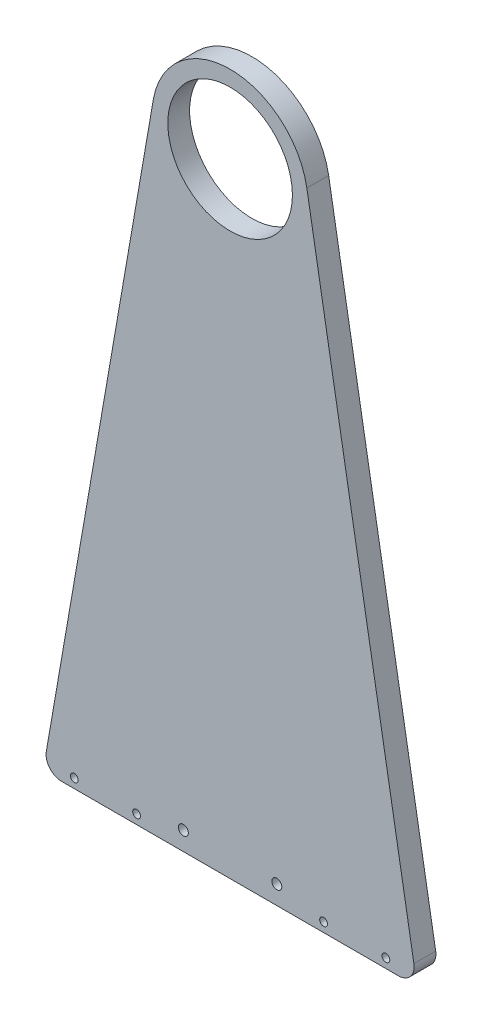
ISO-10303-21;
HEADER;
FILE_DESCRIPTION(('STEP AP214'),'2;1');
FILE_NAME('part.step','',(''),(''),'','','');
FILE_SCHEMA(('AUTOMOTIVE_DESIGN { 1 0 10303 214 1 1 1 1 }'));
ENDSEC;
DATA;
#1=APPLICATION_CONTEXT('core data for automotive mechanical design processes');
#2=APPLICATION_PROTOCOL_DEFINITION('international standard','automotive_design',2000,#1);
#3=PRODUCT_CONTEXT('',#1,'mechanical');
#4=PRODUCT('Part','Part','',(#3));
#5=PRODUCT_RELATED_PRODUCT_CATEGORY('part','',(#4));
#6=PRODUCT_DEFINITION_FORMATION('','',#4);
#7=PRODUCT_DEFINITION_CONTEXT('part definition',#1,'design');
#8=PRODUCT_DEFINITION('design','',#6,#7);
#9=PRODUCT_DEFINITION_SHAPE('','',#8);
#10=(LENGTH_UNIT() NAMED_UNIT(*) SI_UNIT(.MILLI.,.METRE.));
#11=(NAMED_UNIT(*) PLANE_ANGLE_UNIT() SI_UNIT($,.RADIAN.));
#12=(NAMED_UNIT(*) SI_UNIT($,.STERADIAN.) SOLID_ANGLE_UNIT());
#13=UNCERTAINTY_MEASURE_WITH_UNIT(LENGTH_MEASURE(1.E-05),#10,'distance_accuracy_value','');
#14=(GEOMETRIC_REPRESENTATION_CONTEXT(3) GLOBAL_UNCERTAINTY_ASSIGNED_CONTEXT((#13)) GLOBAL_UNIT_ASSIGNED_CONTEXT((#10,
#11,#12)) REPRESENTATION_CONTEXT('',''));
#15=CARTESIAN_POINT('',(0.,0.,0.));
#16=DIRECTION('',(0.,0.,1.));
#17=DIRECTION('',(1.,0.,0.));
#18=AXIS2_PLACEMENT_3D('',#15,#16,#17);
#19=CARTESIAN_POINT('',(0.,0.,7.));
#20=DIRECTION('',(0.,0.,-1.));
#21=DIRECTION('',(-1.,0.,0.));
#22=AXIS2_PLACEMENT_3D('',#19,#20,#21);
#23=CYLINDRICAL_SURFACE('',#22,25.);
#24=CARTESIAN_POINT('',(0.,0.,0.));
#25=DIRECTION('',(0.,0.,1.));
#26=DIRECTION('',(1.,0.,0.));
#27=AXIS2_PLACEMENT_3D('',#24,#25,#26);
#28=CIRCLE('',#27,25.);
#29=CARTESIAN_POINT('',(-24.633500506454,4.26505015193619,0.));
#30=VERTEX_POINT('',#29);
#31=CARTESIAN_POINT('',(24.633500506454,4.26505015193636,0.));
#32=VERTEX_POINT('',#31);
#33=EDGE_CURVE('E102',#30,#32,#28,.F.);
#34=ORIENTED_EDGE('',*,*,#33,.F.);
#35=DIRECTION('',(0.,0.,-1.));
#36=VECTOR('',#35,1.);
#37=CARTESIAN_POINT('',(-24.633500506454,4.26505015193619,7.));
#38=LINE('',#37,#36);
#39=CARTESIAN_POINT('',(-24.633500506454,4.26505015193619,7.));
#40=VERTEX_POINT('',#39);
#41=EDGE_CURVE('E97',#40,#30,#38,.T.);
#42=ORIENTED_EDGE('',*,*,#41,.F.);
#43=CARTESIAN_POINT('',(0.,0.,7.));
#44=DIRECTION('',(0.,0.,1.));
#45=DIRECTION('',(1.,0.,0.));
#46=AXIS2_PLACEMENT_3D('',#43,#44,#45);
#47=CIRCLE('',#46,25.);
#48=CARTESIAN_POINT('',(24.633500506454,4.26505015193636,7.));
#49=VERTEX_POINT('',#48);
#50=EDGE_CURVE('E99',#40,#49,#47,.F.);
#51=ORIENTED_EDGE('',*,*,#50,.T.);
#52=DIRECTION('',(0.,0.,-1.));
#53=VECTOR('',#52,1.);
#54=CARTESIAN_POINT('',(24.633500506454,4.26505015193636,7.));
#55=LINE('',#54,#53);
#56=EDGE_CURVE('E105',#49,#32,#55,.T.);
#57=ORIENTED_EDGE('',*,*,#56,.T.);
#58=EDGE_LOOP('',(#34,#42,#51,#57));
#59=FACE_BOUND('',#58,.T.);
#60=ADVANCED_FACE('F40',(#59),#23,.T.);
#61=CARTESIAN_POINT('',(-24.633500506454,4.26505015193612,7.));
#62=DIRECTION('',(0.98534002025816,-0.170602006077445,0.));
#63=DIRECTION('',(0.170602006077445,0.98534002025816,0.));
#64=AXIS2_PLACEMENT_3D('',#61,#62,#63);
#65=PLANE('',#64);
#66=DIRECTION('',(-0.170602006077445,-0.98534002025816,0.));
#67=VECTOR('',#66,1.);
#68=CARTESIAN_POINT('',(-24.633500506454,4.26505015193612,0.));
#69=LINE('',#68,#67);
#70=CARTESIAN_POINT('',(-58.9866084475951,-194.146989969613,0.));
#71=VERTEX_POINT('',#70);
#72=EDGE_CURVE('E128',#30,#71,#69,.T.);
#73=ORIENTED_EDGE('',*,*,#72,.T.);
#74=DIRECTION('',(0.,0.,-1.));
#75=VECTOR('',#74,1.);
#76=CARTESIAN_POINT('',(-58.9866084475951,-194.146989969613,7.));
#77=LINE('',#76,#75);
#78=CARTESIAN_POINT('',(-58.9866084475951,-194.146989969613,7.));
#79=VERTEX_POINT('',#78);
#80=EDGE_CURVE('E11',#71,#79,#77,.F.);
#81=ORIENTED_EDGE('',*,*,#80,.T.);
#82=DIRECTION('',(-0.170602006077445,-0.98534002025816,0.));
#83=VECTOR('',#82,1.);
#84=CARTESIAN_POINT('',(-24.633500506454,4.26505015193612,7.));
#85=LINE('',#84,#83);
#86=EDGE_CURVE('E107',#40,#79,#85,.T.);
#87=ORIENTED_EDGE('',*,*,#86,.F.);
#88=ORIENTED_EDGE('',*,*,#41,.T.);
#89=EDGE_LOOP('',(#73,#81,#87,#88));
#90=FACE_BOUND('',#89,.T.);
#91=ADVANCED_FACE('F108',(#90),#65,.F.);
#92=CARTESIAN_POINT('',(0.,-200.,7.));
#93=DIRECTION('',(0.,1.,0.));
#94=DIRECTION('',(0.,0.,1.));
#95=AXIS2_PLACEMENT_3D('',#92,#93,#94);
#96=PLANE('',#95);
#97=DIRECTION('',(1.,0.,0.));
#98=VECTOR('',#97,1.);
#99=CARTESIAN_POINT('',(0.,-200.,0.));
#100=LINE('',#99,#98);
#101=CARTESIAN_POINT('',(-54.0599083463042,-200.,0.));
#102=VERTEX_POINT('',#101);
#103=CARTESIAN_POINT('',(54.0599083463056,-200.,0.));
#104=VERTEX_POINT('',#103);
#105=EDGE_CURVE('E119',#102,#104,#100,.T.);
#106=ORIENTED_EDGE('',*,*,#105,.T.);
#107=DIRECTION('',(0.,0.,-1.));
#108=VECTOR('',#107,1.);
#109=CARTESIAN_POINT('',(54.0599083463056,-200.,7.));
#110=LINE('',#109,#108);
#111=CARTESIAN_POINT('',(54.0599083463056,-200.,7.));
#112=VERTEX_POINT('',#111);
#113=EDGE_CURVE('E63',#104,#112,#110,.F.);
#114=ORIENTED_EDGE('',*,*,#113,.T.);
#115=DIRECTION('',(1.,0.,0.));
#116=VECTOR('',#115,1.);
#117=CARTESIAN_POINT('',(0.,-200.,7.));
#118=LINE('',#117,#116);
#119=CARTESIAN_POINT('',(-54.0599083463042,-200.,7.));
#120=VERTEX_POINT('',#119);
#121=EDGE_CURVE('E111',#120,#112,#118,.T.);
#122=ORIENTED_EDGE('',*,*,#121,.F.);
#123=DIRECTION('',(0.,0.,-1.));
#124=VECTOR('',#123,1.);
#125=CARTESIAN_POINT('',(-54.0599083463042,-200.,7.));
#126=LINE('',#125,#124);
#127=EDGE_CURVE('E139',#120,#102,#126,.T.);
#128=ORIENTED_EDGE('',*,*,#127,.T.);
#129=EDGE_LOOP('',(#106,#114,#122,#128));
#130=FACE_BOUND('',#129,.T.);
#131=ADVANCED_FACE('F232',(#130),#96,.F.);
#132=CARTESIAN_POINT('',(24.633500506454,4.26505015193628,7.));
#133=DIRECTION('',(0.985340020258159,0.170602006077451,0.));
#134=DIRECTION('',(-0.170602006077451,0.985340020258159,0.));
#135=AXIS2_PLACEMENT_3D('',#132,#133,#134);
#136=PLANE('',#135);
#137=DIRECTION('',(0.170602006077451,-0.985340020258159,0.));
#138=VECTOR('',#137,1.);
#139=CARTESIAN_POINT('',(24.633500506454,4.26505015193628,7.));
#140=LINE('',#139,#138);
#141=CARTESIAN_POINT('',(58.9866084475964,-194.146989969613,7.));
#142=VERTEX_POINT('',#141);
#143=EDGE_CURVE('E115',#49,#142,#140,.T.);
#144=ORIENTED_EDGE('',*,*,#143,.T.);
#145=DIRECTION('',(0.,0.,-1.));
#146=VECTOR('',#145,1.);
#147=CARTESIAN_POINT('',(58.9866084475964,-194.146989969613,0.));
#148=LINE('',#147,#146);
#149=CARTESIAN_POINT('',(58.9866084475964,-194.146989969613,0.));
#150=VERTEX_POINT('',#149);
#151=EDGE_CURVE('E104',#142,#150,#148,.T.);
#152=ORIENTED_EDGE('',*,*,#151,.T.);
#153=DIRECTION('',(0.170602006077451,-0.985340020258159,0.));
#154=VECTOR('',#153,1.);
#155=CARTESIAN_POINT('',(24.633500506454,4.26505015193628,0.));
#156=LINE('',#155,#154);
#157=EDGE_CURVE('E116',#32,#150,#156,.T.);
#158=ORIENTED_EDGE('',*,*,#157,.F.);
#159=ORIENTED_EDGE('',*,*,#56,.F.);
#160=EDGE_LOOP('',(#144,#152,#158,#159));
#161=FACE_BOUND('',#160,.T.);
#162=ADVANCED_FACE('F200',(#161),#136,.T.);
#163=CARTESIAN_POINT('',(0.,0.,7.));
#164=DIRECTION('',(0.,0.,1.));
#165=DIRECTION('',(1.,0.,0.));
#166=AXIS2_PLACEMENT_3D('',#163,#164,#165);
#167=PLANE('',#166);
#168=CARTESIAN_POINT('',(-50.0017140023922,-197.,7.));
#169=DIRECTION('',(0.,0.,1.));
#170=DIRECTION('',(1.,0.,0.));
#171=AXIS2_PLACEMENT_3D('',#168,#169,#170);
#172=CIRCLE('',#171,1.25);
#173=CARTESIAN_POINT('',(-48.7517140023922,-197.,7.));
#174=VERTEX_POINT('',#173);
#175=EDGE_CURVE('E150',#174,#174,#172,.T.);
#176=ORIENTED_EDGE('',*,*,#175,.F.);
#177=EDGE_LOOP('',(#176));
#178=FACE_BOUND('',#177,.T.);
#179=CARTESIAN_POINT('',(-30.0017140023922,-197.,7.));
#180=DIRECTION('',(0.,0.,1.));
#181=DIRECTION('',(1.,0.,0.));
#182=AXIS2_PLACEMENT_3D('',#179,#180,#181);
#183=CIRCLE('',#182,1.25);
#184=CARTESIAN_POINT('',(-28.7517140023922,-197.,7.));
#185=VERTEX_POINT('',#184);
#186=EDGE_CURVE('E188',#185,#185,#183,.T.);
#187=ORIENTED_EDGE('',*,*,#186,.F.);
#188=EDGE_LOOP('',(#187));
#189=FACE_BOUND('',#188,.T.);
#190=CARTESIAN_POINT('',(30.0017140023936,-197.,7.));
#191=DIRECTION('',(0.,0.,1.));
#192=DIRECTION('',(-1.,0.,0.));
#193=AXIS2_PLACEMENT_3D('',#190,#191,#192);
#194=CIRCLE('',#193,1.25);
#195=CARTESIAN_POINT('',(28.7517140023936,-197.,7.));
#196=VERTEX_POINT('',#195);
#197=EDGE_CURVE('E185',#196,#196,#194,.T.);
#198=ORIENTED_EDGE('',*,*,#197,.F.);
#199=EDGE_LOOP('',(#198));
#200=FACE_BOUND('',#199,.T.);
#201=CARTESIAN_POINT('',(50.0017140023936,-197.,7.));
#202=DIRECTION('',(0.,0.,1.));
#203=DIRECTION('',(-1.,0.,0.));
#204=AXIS2_PLACEMENT_3D('',#201,#202,#203);
#205=CIRCLE('',#204,1.25);
#206=CARTESIAN_POINT('',(48.7517140023936,-197.,7.));
#207=VERTEX_POINT('',#206);
#208=EDGE_CURVE('E182',#207,#207,#205,.T.);
#209=ORIENTED_EDGE('',*,*,#208,.F.);
#210=EDGE_LOOP('',(#209));
#211=FACE_BOUND('',#210,.T.);
#212=CARTESIAN_POINT('',(-15.0017140023922,-194.,7.));
#213=DIRECTION('',(0.,0.,1.));
#214=DIRECTION('',(1.,0.,0.));
#215=AXIS2_PLACEMENT_3D('',#212,#213,#214);
#216=CIRCLE('',#215,1.6);
#217=CARTESIAN_POINT('',(-13.4017140023922,-194.,7.));
#218=VERTEX_POINT('',#217);
#219=EDGE_CURVE('E166',#218,#218,#216,.T.);
#220=ORIENTED_EDGE('',*,*,#219,.F.);
#221=EDGE_LOOP('',(#220));
#222=FACE_BOUND('',#221,.T.);
#223=CARTESIAN_POINT('',(14.9982859976078,-194.,7.));
#224=DIRECTION('',(0.,0.,1.));
#225=DIRECTION('',(1.,0.,0.));
#226=AXIS2_PLACEMENT_3D('',#223,#224,#225);
#227=CIRCLE('',#226,1.6);
#228=CARTESIAN_POINT('',(16.5982859976078,-194.,7.));
#229=VERTEX_POINT('',#228);
#230=EDGE_CURVE('E157',#229,#229,#227,.T.);
#231=ORIENTED_EDGE('',*,*,#230,.F.);
#232=EDGE_LOOP('',(#231));
#233=FACE_BOUND('',#232,.T.);
#234=CARTESIAN_POINT('',(0.,0.,7.));
#235=DIRECTION('',(0.,0.,1.));
#236=DIRECTION('',(1.,0.,0.));
#237=AXIS2_PLACEMENT_3D('',#234,#235,#236);
#238=CIRCLE('',#237,20.);
#239=CARTESIAN_POINT('',(20.,0.,7.));
#240=VERTEX_POINT('',#239);
#241=EDGE_CURVE('E122',#240,#240,#238,.T.);
#242=ORIENTED_EDGE('',*,*,#241,.F.);
#243=EDGE_LOOP('',(#242));
#244=FACE_BOUND('',#243,.T.);
#245=ORIENTED_EDGE('',*,*,#121,.T.);
#246=CARTESIAN_POINT('',(54.0599083463056,-195.,7.));
#247=DIRECTION('',(0.,0.,1.));
#248=DIRECTION('',(1.,0.,0.));
#249=AXIS2_PLACEMENT_3D('',#246,#247,#248);
#250=CIRCLE('',#249,5.);
#251=EDGE_CURVE('E49',#112,#142,#250,.T.);
#252=ORIENTED_EDGE('',*,*,#251,.T.);
#253=ORIENTED_EDGE('',*,*,#143,.F.);
#254=ORIENTED_EDGE('',*,*,#50,.F.);
#255=ORIENTED_EDGE('',*,*,#86,.T.);
#256=CARTESIAN_POINT('',(-54.0599083463042,-195.,7.));
#257=DIRECTION('',(0.,0.,1.));
#258=DIRECTION('',(1.,0.,0.));
#259=AXIS2_PLACEMENT_3D('',#256,#257,#258);
#260=CIRCLE('',#259,5.);
#261=EDGE_CURVE('E143',#79,#120,#260,.T.);
#262=ORIENTED_EDGE('',*,*,#261,.T.);
#263=EDGE_LOOP('',(#245,#252,#253,#254,#255,#262));
#264=FACE_BOUND('',#263,.T.);
#265=ADVANCED_FACE('F113',(#178,#189,#200,#211,#222,#233,#244,#264),#167,.T.);
#266=CARTESIAN_POINT('',(0.,0.,0.));
#267=DIRECTION('',(0.,0.,1.));
#268=DIRECTION('',(1.,0.,0.));
#269=AXIS2_PLACEMENT_3D('',#266,#267,#268);
#270=PLANE('',#269);
#271=CARTESIAN_POINT('',(-50.0017140023922,-197.,0.));
#272=DIRECTION('',(0.,0.,1.));
#273=DIRECTION('',(1.,0.,0.));
#274=AXIS2_PLACEMENT_3D('',#271,#272,#273);
#275=CIRCLE('',#274,1.25);
#276=CARTESIAN_POINT('',(-48.7517140023922,-197.,0.));
#277=VERTEX_POINT('',#276);
#278=EDGE_CURVE('E44',#277,#277,#275,.T.);
#279=ORIENTED_EDGE('',*,*,#278,.T.);
#280=EDGE_LOOP('',(#279));
#281=FACE_BOUND('',#280,.T.);
#282=CARTESIAN_POINT('',(-30.0017140023922,-197.,0.));
#283=DIRECTION('',(0.,0.,1.));
#284=DIRECTION('',(1.,0.,0.));
#285=AXIS2_PLACEMENT_3D('',#282,#283,#284);
#286=CIRCLE('',#285,1.25);
#287=CARTESIAN_POINT('',(-28.7517140023922,-197.,0.));
#288=VERTEX_POINT('',#287);
#289=EDGE_CURVE('E152',#288,#288,#286,.T.);
#290=ORIENTED_EDGE('',*,*,#289,.T.);
#291=EDGE_LOOP('',(#290));
#292=FACE_BOUND('',#291,.T.);
#293=CARTESIAN_POINT('',(30.0017140023936,-197.,0.));
#294=DIRECTION('',(0.,0.,1.));
#295=DIRECTION('',(1.,0.,0.));
#296=AXIS2_PLACEMENT_3D('',#293,#294,#295);
#297=CIRCLE('',#296,1.25);
#298=CARTESIAN_POINT('',(31.2517140023936,-197.,0.));
#299=VERTEX_POINT('',#298);
#300=EDGE_CURVE('E149',#299,#299,#297,.T.);
#301=ORIENTED_EDGE('',*,*,#300,.T.);
#302=EDGE_LOOP('',(#301));
#303=FACE_BOUND('',#302,.T.);
#304=CARTESIAN_POINT('',(50.0017140023936,-197.,0.));
#305=DIRECTION('',(0.,0.,1.));
#306=DIRECTION('',(1.,0.,0.));
#307=AXIS2_PLACEMENT_3D('',#304,#305,#306);
#308=CIRCLE('',#307,1.25);
#309=CARTESIAN_POINT('',(51.2517140023936,-197.,0.));
#310=VERTEX_POINT('',#309);
#311=EDGE_CURVE('E146',#310,#310,#308,.T.);
#312=ORIENTED_EDGE('',*,*,#311,.T.);
#313=EDGE_LOOP('',(#312));
#314=FACE_BOUND('',#313,.T.);
#315=CARTESIAN_POINT('',(-15.0017140023922,-194.,0.));
#316=DIRECTION('',(0.,0.,1.));
#317=DIRECTION('',(1.,0.,0.));
#318=AXIS2_PLACEMENT_3D('',#315,#316,#317);
#319=CIRCLE('',#318,1.6);
#320=CARTESIAN_POINT('',(-13.4017140023922,-194.,0.));
#321=VERTEX_POINT('',#320);
#322=EDGE_CURVE('E173',#321,#321,#319,.T.);
#323=ORIENTED_EDGE('',*,*,#322,.T.);
#324=EDGE_LOOP('',(#323));
#325=FACE_BOUND('',#324,.T.);
#326=CARTESIAN_POINT('',(14.9982859976078,-194.,0.));
#327=DIRECTION('',(0.,0.,1.));
#328=DIRECTION('',(1.,0.,0.));
#329=AXIS2_PLACEMENT_3D('',#326,#327,#328);
#330=CIRCLE('',#329,1.6);
#331=CARTESIAN_POINT('',(16.5982859976078,-194.,0.));
#332=VERTEX_POINT('',#331);
#333=EDGE_CURVE('E161',#332,#332,#330,.T.);
#334=ORIENTED_EDGE('',*,*,#333,.T.);
#335=EDGE_LOOP('',(#334));
#336=FACE_BOUND('',#335,.T.);
#337=CARTESIAN_POINT('',(0.,0.,0.));
#338=DIRECTION('',(0.,0.,1.));
#339=DIRECTION('',(1.,0.,0.));
#340=AXIS2_PLACEMENT_3D('',#337,#338,#339);
#341=CIRCLE('',#340,20.);
#342=CARTESIAN_POINT('',(20.,0.,0.));
#343=VERTEX_POINT('',#342);
#344=EDGE_CURVE('E129',#343,#343,#341,.T.);
#345=ORIENTED_EDGE('',*,*,#344,.T.);
#346=EDGE_LOOP('',(#345));
#347=FACE_BOUND('',#346,.T.);
#348=ORIENTED_EDGE('',*,*,#157,.T.);
#349=CARTESIAN_POINT('',(54.0599083463056,-195.,0.));
#350=DIRECTION('',(0.,0.,1.));
#351=DIRECTION('',(1.,0.,0.));
#352=AXIS2_PLACEMENT_3D('',#349,#350,#351);
#353=CIRCLE('',#352,5.);
#354=EDGE_CURVE('E137',#150,#104,#353,.F.);
#355=ORIENTED_EDGE('',*,*,#354,.T.);
#356=ORIENTED_EDGE('',*,*,#105,.F.);
#357=CARTESIAN_POINT('',(-54.0599083463042,-195.,0.));
#358=DIRECTION('',(0.,0.,1.));
#359=DIRECTION('',(1.,0.,0.));
#360=AXIS2_PLACEMENT_3D('',#357,#358,#359);
#361=CIRCLE('',#360,5.);
#362=EDGE_CURVE('E135',#102,#71,#361,.F.);
#363=ORIENTED_EDGE('',*,*,#362,.T.);
#364=ORIENTED_EDGE('',*,*,#72,.F.);
#365=ORIENTED_EDGE('',*,*,#33,.T.);
#366=EDGE_LOOP('',(#348,#355,#356,#363,#364,#365));
#367=FACE_BOUND('',#366,.T.);
#368=ADVANCED_FACE('F199',(#281,#292,#303,#314,#325,#336,#347,#367),#270,.F.);
#369=CARTESIAN_POINT('',(0.,0.,0.));
#370=DIRECTION('',(0.,0.,1.));
#371=DIRECTION('',(1.,0.,0.));
#372=AXIS2_PLACEMENT_3D('',#369,#370,#371);
#373=CYLINDRICAL_SURFACE('',#372,20.);
#374=ORIENTED_EDGE('',*,*,#344,.F.);
#375=EDGE_LOOP('',(#374));
#376=FACE_BOUND('',#375,.T.);
#377=ORIENTED_EDGE('',*,*,#241,.T.);
#378=EDGE_LOOP('',(#377));
#379=FACE_BOUND('',#378,.T.);
#380=ADVANCED_FACE('F223',(#376,#379),#373,.F.);
#381=CARTESIAN_POINT('',(14.9982859976078,-194.,0.));
#382=DIRECTION('',(0.,0.,1.));
#383=DIRECTION('',(1.,0.,0.));
#384=AXIS2_PLACEMENT_3D('',#381,#382,#383);
#385=CYLINDRICAL_SURFACE('',#384,1.6);
#386=ORIENTED_EDGE('',*,*,#333,.F.);
#387=EDGE_LOOP('',(#386));
#388=FACE_BOUND('',#387,.T.);
#389=ORIENTED_EDGE('',*,*,#230,.T.);
#390=EDGE_LOOP('',(#389));
#391=FACE_BOUND('',#390,.T.);
#392=ADVANCED_FACE('F215',(#388,#391),#385,.F.);
#393=CARTESIAN_POINT('',(-15.0017140023922,-194.,0.));
#394=DIRECTION('',(0.,0.,1.));
#395=DIRECTION('',(1.,0.,0.));
#396=AXIS2_PLACEMENT_3D('',#393,#394,#395);
#397=CYLINDRICAL_SURFACE('',#396,1.6);
#398=ORIENTED_EDGE('',*,*,#322,.F.);
#399=EDGE_LOOP('',(#398));
#400=FACE_BOUND('',#399,.T.);
#401=ORIENTED_EDGE('',*,*,#219,.T.);
#402=EDGE_LOOP('',(#401));
#403=FACE_BOUND('',#402,.T.);
#404=ADVANCED_FACE('F212',(#400,#403),#397,.F.);
#405=CARTESIAN_POINT('',(54.0599083463056,-195.,7.));
#406=DIRECTION('',(0.,0.,1.));
#407=DIRECTION('',(1.,0.,0.));
#408=AXIS2_PLACEMENT_3D('',#405,#406,#407);
#409=CYLINDRICAL_SURFACE('',#408,5.);
#410=ORIENTED_EDGE('',*,*,#251,.F.);
#411=ORIENTED_EDGE('',*,*,#113,.F.);
#412=ORIENTED_EDGE('',*,*,#354,.F.);
#413=ORIENTED_EDGE('',*,*,#151,.F.);
#414=EDGE_LOOP('',(#410,#411,#412,#413));
#415=FACE_BOUND('',#414,.T.);
#416=ADVANCED_FACE('F214',(#415),#409,.T.);
#417=CARTESIAN_POINT('',(-54.0599083463042,-195.,7.));
#418=DIRECTION('',(0.,0.,-1.));
#419=DIRECTION('',(-1.,0.,0.));
#420=AXIS2_PLACEMENT_3D('',#417,#418,#419);
#421=CYLINDRICAL_SURFACE('',#420,5.);
#422=ORIENTED_EDGE('',*,*,#261,.F.);
#423=ORIENTED_EDGE('',*,*,#80,.F.);
#424=ORIENTED_EDGE('',*,*,#362,.F.);
#425=ORIENTED_EDGE('',*,*,#127,.F.);
#426=EDGE_LOOP('',(#422,#423,#424,#425));
#427=FACE_BOUND('',#426,.T.);
#428=ADVANCED_FACE('F42',(#427),#421,.T.);
#429=CARTESIAN_POINT('',(50.0017140023936,-197.,-3.));
#430=DIRECTION('',(0.,0.,1.));
#431=DIRECTION('',(1.,0.,0.));
#432=AXIS2_PLACEMENT_3D('',#429,#430,#431);
#433=CYLINDRICAL_SURFACE('',#432,1.25);
#434=ORIENTED_EDGE('',*,*,#208,.T.);
#435=EDGE_LOOP('',(#434));
#436=FACE_BOUND('',#435,.T.);
#437=ORIENTED_EDGE('',*,*,#311,.F.);
#438=EDGE_LOOP('',(#437));
#439=FACE_BOUND('',#438,.T.);
#440=ADVANCED_FACE('F285',(#436,#439),#433,.F.);
#441=CARTESIAN_POINT('',(30.0017140023936,-197.,-3.));
#442=DIRECTION('',(0.,0.,1.));
#443=DIRECTION('',(1.,0.,0.));
#444=AXIS2_PLACEMENT_3D('',#441,#442,#443);
#445=CYLINDRICAL_SURFACE('',#444,1.25);
#446=ORIENTED_EDGE('',*,*,#197,.T.);
#447=EDGE_LOOP('',(#446));
#448=FACE_BOUND('',#447,.T.);
#449=ORIENTED_EDGE('',*,*,#300,.F.);
#450=EDGE_LOOP('',(#449));
#451=FACE_BOUND('',#450,.T.);
#452=ADVANCED_FACE('F275',(#448,#451),#445,.F.);
#453=CARTESIAN_POINT('',(-30.0017140023922,-197.,-3.));
#454=DIRECTION('',(0.,0.,1.));
#455=DIRECTION('',(1.,0.,0.));
#456=AXIS2_PLACEMENT_3D('',#453,#454,#455);
#457=CYLINDRICAL_SURFACE('',#456,1.25);
#458=ORIENTED_EDGE('',*,*,#186,.T.);
#459=EDGE_LOOP('',(#458));
#460=FACE_BOUND('',#459,.T.);
#461=ORIENTED_EDGE('',*,*,#289,.F.);
#462=EDGE_LOOP('',(#461));
#463=FACE_BOUND('',#462,.T.);
#464=ADVANCED_FACE('F266',(#460,#463),#457,.F.);
#465=CARTESIAN_POINT('',(-50.0017140023922,-197.,-3.));
#466=DIRECTION('',(0.,0.,1.));
#467=DIRECTION('',(1.,0.,0.));
#468=AXIS2_PLACEMENT_3D('',#465,#466,#467);
#469=CYLINDRICAL_SURFACE('',#468,1.25);
#470=ORIENTED_EDGE('',*,*,#175,.T.);
#471=EDGE_LOOP('',(#470));
#472=FACE_BOUND('',#471,.T.);
#473=ORIENTED_EDGE('',*,*,#278,.F.);
#474=EDGE_LOOP('',(#473));
#475=FACE_BOUND('',#474,.T.);
#476=ADVANCED_FACE('F194',(#472,#475),#469,.F.);
#477=CLOSED_SHELL('',(#60,#91,#131,#162,#265,#368,#380,#392,#404,#416,#428,#440,#452,#464,#476));
#478=MANIFOLD_SOLID_BREP('B2',#477);
#479=ADVANCED_BREP_SHAPE_REPRESENTATION('',(#18,#478),#14);
#480=SHAPE_DEFINITION_REPRESENTATION(#9,#479);
ENDSEC;
END-ISO-10303-21;
